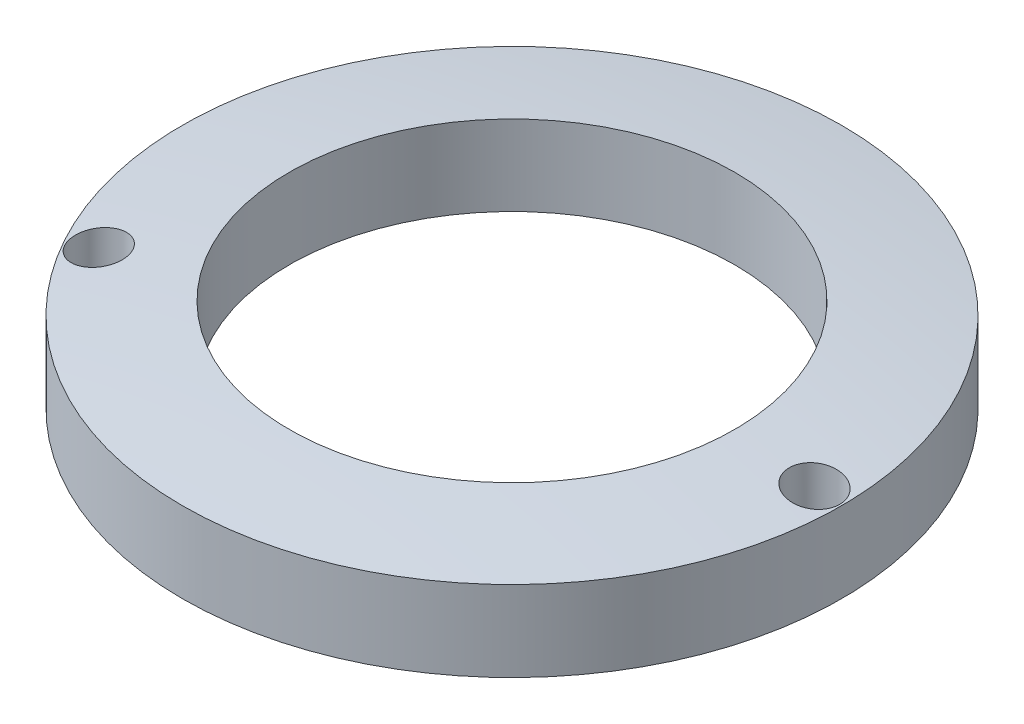
ISO-10303-21;
HEADER;
FILE_DESCRIPTION(('STEP AP214'),'2;1');
FILE_NAME('part.step','',(''),(''),'','','');
FILE_SCHEMA(('AUTOMOTIVE_DESIGN { 1 0 10303 214 1 1 1 1 }'));
ENDSEC;
DATA;
#1=APPLICATION_CONTEXT('core data for automotive mechanical design processes');
#2=APPLICATION_PROTOCOL_DEFINITION('international standard','automotive_design',2000,#1);
#3=PRODUCT_CONTEXT('',#1,'mechanical');
#4=PRODUCT('Part','Part','',(#3));
#5=PRODUCT_RELATED_PRODUCT_CATEGORY('part','',(#4));
#6=PRODUCT_DEFINITION_FORMATION('','',#4);
#7=PRODUCT_DEFINITION_CONTEXT('part definition',#1,'design');
#8=PRODUCT_DEFINITION('design','',#6,#7);
#9=PRODUCT_DEFINITION_SHAPE('','',#8);
#10=(LENGTH_UNIT() NAMED_UNIT(*) SI_UNIT(.MILLI.,.METRE.));
#11=(NAMED_UNIT(*) PLANE_ANGLE_UNIT() SI_UNIT($,.RADIAN.));
#12=(NAMED_UNIT(*) SI_UNIT($,.STERADIAN.) SOLID_ANGLE_UNIT());
#13=UNCERTAINTY_MEASURE_WITH_UNIT(LENGTH_MEASURE(1.E-05),#10,'distance_accuracy_value','');
#14=(GEOMETRIC_REPRESENTATION_CONTEXT(3) GLOBAL_UNCERTAINTY_ASSIGNED_CONTEXT((#13)) GLOBAL_UNIT_ASSIGNED_CONTEXT((#10,
#11,#12)) REPRESENTATION_CONTEXT('',''));
#15=CARTESIAN_POINT('',(0.,0.,0.));
#16=DIRECTION('',(0.,0.,1.));
#17=DIRECTION('',(1.,0.,0.));
#18=AXIS2_PLACEMENT_3D('',#15,#16,#17);
#19=CARTESIAN_POINT('',(0.,0.,0.));
#20=DIRECTION('',(0.,-1.,0.));
#21=DIRECTION('',(1.,0.,0.));
#22=AXIS2_PLACEMENT_3D('',#19,#20,#21);
#23=SPHERICAL_SURFACE('',#22,270.25);
#24=CARTESIAN_POINT('',(33.8748210520034,268.110191946633,-2.11745563731514));
#25=CARTESIAN_POINT('',(33.7566342169158,268.126061113324,-1.99882785031653));
#26=CARTESIAN_POINT('',(33.6482325747992,268.140615732032,-1.87011115871031));
#27=CARTESIAN_POINT('',(33.4542554238601,268.166657879572,-1.59606487354717));
#28=CARTESIAN_POINT('',(33.3687051319892,268.178142020079,-1.45071717780177));
#29=CARTESIAN_POINT('',(33.2230708792682,268.19769100597,-1.14757327787246));
#30=CARTESIAN_POINT('',(33.1629829895249,268.205756378876,-0.98977899867834));
#31=CARTESIAN_POINT('',(33.0700821017238,268.218225772245,-0.666258971449716));
#32=CARTESIAN_POINT('',(33.037262429422,268.222630688651,-0.500535174774585));
#33=CARTESIAN_POINT('',(32.9999509043105,268.227638469603,-0.166679806506815));
#34=CARTESIAN_POINT('',(32.9953236963594,268.228259500999,0.00143636981917927));
#35=CARTESIAN_POINT('',(33.0141757902299,268.225729275299,0.336059702495806));
#36=CARTESIAN_POINT('',(33.0376555592694,268.222577955495,0.502566832053126));
#37=CARTESIAN_POINT('',(33.1119370524958,268.212607937365,0.828873560222206));
#38=CARTESIAN_POINT('',(33.1626797104888,268.205797167391,0.988686857409833));
#39=CARTESIAN_POINT('',(33.2899444679582,268.188714473383,1.29749368980713));
#40=CARTESIAN_POINT('',(33.3664668042341,268.178442517558,1.44648712561558));
#41=CARTESIAN_POINT('',(33.5433678902146,268.154694444906,1.73002314791829));
#42=CARTESIAN_POINT('',(33.6438309299845,268.141207006985,1.86451218078449));
#43=CARTESIAN_POINT('',(33.8655509977646,268.111437744019,2.11472761211457));
#44=CARTESIAN_POINT('',(33.9868087594051,268.095155820385,2.23045334833575));
#45=CARTESIAN_POINT('',(34.2476655467542,268.060125511359,2.44082248276524));
#46=CARTESIAN_POINT('',(34.387398837805,268.041359069037,2.53529637050503));
#47=CARTESIAN_POINT('',(34.6804956364039,268.001991039657,2.69946792084331));
#48=CARTESIAN_POINT('',(34.8338597958272,267.981389364832,2.76916439770263));
#49=CARTESIAN_POINT('',(35.1512696834828,267.938745874557,2.88241049827879));
#50=CARTESIAN_POINT('',(35.3153953858558,267.916693271103,2.925731952833));
#51=CARTESIAN_POINT('',(35.648510674052,267.871928787457,2.98413347266546));
#52=CARTESIAN_POINT('',(35.8175004397025,267.849216882891,2.99921249243884));
#53=CARTESIAN_POINT('',(36.1565682888054,267.803640948663,3.00073154643874));
#54=CARTESIAN_POINT('',(36.3266471087594,267.780776786796,2.98700866327034));
#55=CARTESIAN_POINT('',(36.6621132085578,267.735673487465,2.93095999454714));
#56=CARTESIAN_POINT('',(36.8275004355219,267.713434357047,2.88863388673054));
#57=CARTESIAN_POINT('',(37.148918762869,267.670209057124,2.77650222412124));
#58=CARTESIAN_POINT('',(37.3049469486164,267.649223277953,2.70668815957792));
#59=CARTESIAN_POINT('',(37.6030880495625,267.609118983338,2.54148604193802));
#60=CARTESIAN_POINT('',(37.7452012645592,267.590000427663,2.44609853998684));
#61=CARTESIAN_POINT('',(38.0106522156855,267.554285815633,2.23295750074317));
#62=CARTESIAN_POINT('',(38.1340845209908,267.537677054542,2.11532389921269));
#63=CARTESIAN_POINT('',(38.3594184611513,267.507354293866,1.86065786002901));
#64=CARTESIAN_POINT('',(38.4613210715009,267.493640163128,1.72362630175272));
#65=CARTESIAN_POINT('',(38.6397753987595,267.469622228116,1.43530023637066));
#66=CARTESIAN_POINT('',(38.7165353833011,267.459290407071,1.28413696849114));
#67=CARTESIAN_POINT('',(38.8435817932535,267.442189425082,0.970878992282544));
#68=CARTESIAN_POINT('',(38.893869500614,267.435420091622,0.80878481372393));
#69=CARTESIAN_POINT('',(38.9661578950883,267.425689033931,0.479656380144535));
#70=CARTESIAN_POINT('',(38.988380951073,267.422697377482,0.312671825559643));
#71=CARTESIAN_POINT('',(39.0046072788964,267.420513007519,-0.0226854887005422));
#72=CARTESIAN_POINT('',(38.9986113671663,267.421320184097,-0.191058208072758));
#73=CARTESIAN_POINT('',(38.958660710383,267.426698248088,-0.52372134538931));
#74=CARTESIAN_POINT('',(38.9248150114554,267.431254456129,-0.688025115001661));
#75=CARTESIAN_POINT('',(38.8303150443874,267.443975174114,-1.00858268892265));
#76=CARTESIAN_POINT('',(38.7696607618451,267.452139685995,-1.16483648890666));
#77=CARTESIAN_POINT('',(38.6231972015243,267.471853469363,-1.46519831797986));
#78=CARTESIAN_POINT('',(38.5373412451101,267.483409021737,-1.60928316421017));
#79=CARTESIAN_POINT('',(38.3430258445032,267.50956022098,-1.88099147695932));
#80=CARTESIAN_POINT('',(38.234565672158,267.524155965783,-2.00861441297416));
#81=CARTESIAN_POINT('',(37.9973559713826,267.556074731758,-2.24471845272349));
#82=CARTESIAN_POINT('',(37.8684741182715,267.573415539129,-2.35306418701929));
#83=CARTESIAN_POINT('',(37.5946435122869,267.610254859392,-2.54661093254369));
#84=CARTESIAN_POINT('',(37.4496939879875,267.629753475883,-2.63181083183812));
#85=CARTESIAN_POINT('',(37.1464844145498,267.670536370907,-2.77742754512343));
#86=CARTESIAN_POINT('',(36.9881190929644,267.691834768124,-2.83762122038843));
#87=CARTESIAN_POINT('',(36.6636655628318,267.735464694298,-2.93053337626499));
#88=CARTESIAN_POINT('',(36.4975773242902,267.757796227268,-2.96325175015792));
#89=CARTESIAN_POINT('',(36.1611770150129,267.803021397737,-3.00047561058272));
#90=CARTESIAN_POINT('',(35.9908438976689,267.825917825525,-3.00478767138788));
#91=CARTESIAN_POINT('',(35.6518190650947,267.871484196704,-2.98456206308923));
#92=CARTESIAN_POINT('',(35.4831277976132,267.894154078357,-2.96001673491787));
#93=CARTESIAN_POINT('',(35.1518007953607,267.938674593639,-2.88263508608959));
#94=CARTESIAN_POINT('',(34.9891816155954,267.960522988546,-2.82972671588607));
#95=CARTESIAN_POINT('',(34.6752476191331,268.002696076445,-2.69703628961669));
#96=CARTESIAN_POINT('',(34.5239194411801,268.023022570487,-2.61728663285815));
#97=CARTESIAN_POINT('',(34.2891915878442,268.054548336168,-2.46676224764369));
#98=CARTESIAN_POINT('',(34.2011124361431,268.066377258445,-2.40328264668014));
#99=CARTESIAN_POINT('',(34.0322569365905,268.089052454216,-2.26710210382388));
#100=CARTESIAN_POINT('',(33.9514805769168,268.099898729301,-2.19440117685941));
#101=CARTESIAN_POINT('',(33.8748210520034,268.110191946633,-2.11745563731514));
#102=B_SPLINE_CURVE_WITH_KNOTS('',3,(#24,#25,#26,#27,#28,#29,#30,#31,#32,#33,#34,#35,#36,#37,
#38,#39,#40,#41,#42,#43,#44,#45,#46,#47,#48,#49,#50,#51,#52,#53,#54,#55,#56,#57,#58,#59,#60,#61,
#62,#63,#64,#65,#66,#67,#68,#69,#70,#71,#72,#73,#74,#75,#76,#77,#78,#79,#80,#81,#82,#83,#84,#85,
#86,#87,#88,#89,#90,#91,#92,#93,#94,#95,#96,#97,#98,#99,#100,#101),.UNSPECIFIED.,.T.,.F.,(4,2,2,
2,2,2,2,2,2,2,2,2,2,2,2,2,2,2,2,2,2,2,2,2,2,2,2,2,2,2,2,2,2,2,2,2,2,2,4),(0.,0.504217313290887,
1.00898876367502,1.51368229855581,2.01825226683611,2.52039781766302,3.02255171569263,
3.52362203756852,4.02469696215641,4.527562829559,5.03044644153995,5.53720918689176,
6.04399618044193,6.55510727815307,7.06623729627893,7.58026630110192,8.09430109739329,
8.60849515440136,9.12267813065783,9.63416417772537,10.145627044771,10.6527392831857,
11.1598269618647,11.6628710182489,12.1659005206526,12.6669697261641,13.1680392008588,
13.6700426784524,14.1720623296465,14.6774789677222,15.1829198819016,15.6927788564975,
16.2026398114609,16.7159689808202,17.2294344241342,17.7442104279674,18.2583672764971,
18.5854182736365,18.9124687413248),.UNSPECIFIED.);
#103=CARTESIAN_POINT('',(33.8748210520034,268.110191946633,-2.11745563731514));
#104=VERTEX_POINT('',#103);
#105=EDGE_CURVE('E59',#104,#104,#102,.T.);
#106=ORIENTED_EDGE('',*,*,#105,.T.);
#107=EDGE_LOOP('',(#106));
#108=FACE_BOUND('',#107,.T.);
#109=CARTESIAN_POINT('',(0.,267.38895657824,0.));
#110=DIRECTION('',(0.,-1.,0.));
#111=DIRECTION('',(0.,0.,-1.));
#112=AXIS2_PLACEMENT_3D('',#109,#110,#111);
#113=CIRCLE('',#112,39.22);
#114=CARTESIAN_POINT('',(0.,267.38895657824,-39.22));
#115=VERTEX_POINT('',#114);
#116=EDGE_CURVE('E10',#115,#115,#113,.T.);
#117=ORIENTED_EDGE('',*,*,#116,.T.);
#118=EDGE_LOOP('',(#117));
#119=FACE_BOUND('',#118,.T.);
#120=CARTESIAN_POINT('',(0.,268.946616264269,0.));
#121=DIRECTION('',(0.,-1.,0.));
#122=DIRECTION('',(0.,0.,-1.));
#123=AXIS2_PLACEMENT_3D('',#120,#121,#122);
#124=CIRCLE('',#123,26.51);
#125=CARTESIAN_POINT('',(0.,268.946616264269,-26.51));
#126=VERTEX_POINT('',#125);
#127=EDGE_CURVE('E83',#126,#126,#124,.T.);
#128=ORIENTED_EDGE('',*,*,#127,.F.);
#129=EDGE_LOOP('',(#128));
#130=FACE_BOUND('',#129,.T.);
#131=CARTESIAN_POINT('',(-33.2575393534441,267.727720951441,15.8387502758738));
#132=CARTESIAN_POINT('',(-33.3793015351468,267.705660077118,15.9559801413458));
#133=CARTESIAN_POINT('',(-33.4912636586201,267.684035988823,16.0836466974702));
#134=CARTESIAN_POINT('',(-33.6922596330757,267.642289474537,16.3562895597185));
#135=CARTESIAN_POINT('',(-33.7812668179456,267.622168814129,16.5012857136809));
#136=CARTESIAN_POINT('',(-33.9336131258105,267.584028750472,16.8044363569805));
#137=CARTESIAN_POINT('',(-33.9969562989633,267.566009015987,16.9625887653157));
#138=CARTESIAN_POINT('',(-34.0960322862219,267.532602046169,17.2875403570274));
#139=CARTESIAN_POINT('',(-34.1317723560798,267.517214119869,17.4543372558032));
#140=CARTESIAN_POINT('',(-34.1743886325436,267.489603882682,17.7908477028342));
#141=CARTESIAN_POINT('',(-34.1814312563982,267.477363706917,17.9605386878008));
#142=CARTESIAN_POINT('',(-34.1667862809966,267.456299914433,18.2988971072288));
#143=CARTESIAN_POINT('',(-34.1450989367728,267.447476267386,18.4675645507627));
#144=CARTESIAN_POINT('',(-34.0738377524782,267.43357398587,18.7975499536216));
#145=CARTESIAN_POINT('',(-34.0245035432514,267.428464025431,18.9589183602977));
#146=CARTESIAN_POINT('',(-33.8994833926352,267.422021187206,19.271180600943));
#147=CARTESIAN_POINT('',(-33.8237984811024,267.420688161825,19.4220748439943));
#148=CARTESIAN_POINT('',(-33.6487078045413,267.421836269065,19.7082836607177));
#149=CARTESIAN_POINT('',(-33.5494302092204,267.424297174014,19.8436767522319));
#150=CARTESIAN_POINT('',(-33.3297881909491,267.432921539283,20.0959744293874));
#151=CARTESIAN_POINT('',(-33.2094239594727,267.439084965984,20.2128791828908));
#152=CARTESIAN_POINT('',(-32.9510356218144,267.454932116281,20.4249612812851));
#153=CARTESIAN_POINT('',(-32.8130075923072,267.464616622829,20.5201337860869));
#154=CARTESIAN_POINT('',(-32.5232543044256,267.48721990451,20.6861215331342));
#155=CARTESIAN_POINT('',(-32.371528713548,267.500138758169,20.7569361839012));
#156=CARTESIAN_POINT('',(-32.0577892127872,267.528916303892,20.8726594400928));
#157=CARTESIAN_POINT('',(-31.8957223020539,267.54479110091,20.9174203019582));
#158=CARTESIAN_POINT('',(-31.5666444154433,267.578974039687,20.9792859218482));
#159=CARTESIAN_POINT('',(-31.3996332268425,267.597282286262,20.9963894881742));
#160=CARTESIAN_POINT('',(-31.0638837248674,267.635978324455,21.0026079770012));
#161=CARTESIAN_POINT('',(-30.8951428512852,267.65638255432,20.9914824020852));
#162=CARTESIAN_POINT('',(-30.5620788611804,267.698559951365,20.9411473050748));
#163=CARTESIAN_POINT('',(-30.3977559464196,267.720333180914,20.9019365026202));
#164=CARTESIAN_POINT('',(-30.0768427591206,267.76481158248,20.7961767741625));
#165=CARTESIAN_POINT('',(-29.9203226149474,267.787522688389,20.7294174732467));
#166=CARTESIAN_POINT('',(-29.6208009520962,267.833075151389,20.5704587271744));
#167=CARTESIAN_POINT('',(-29.4777998126528,267.855916512114,20.478258568636));
#168=CARTESIAN_POINT('',(-29.2088633969345,267.90116841697,20.2706249742627));
#169=CARTESIAN_POINT('',(-29.0829920739584,267.923577092307,20.1551082671137));
#170=CARTESIAN_POINT('',(-28.8525525810634,267.967239023512,19.9042959756846));
#171=CARTESIAN_POINT('',(-28.7479843586631,267.988492282227,19.7690004401322));
#172=CARTESIAN_POINT('',(-28.563410452566,268.029188772111,19.4827462987591));
#173=CARTESIAN_POINT('',(-28.4833530277976,268.04863575489,19.3318215999367));
#174=CARTESIAN_POINT('',(-28.3499040959961,268.085205341504,19.018345491905));
#175=CARTESIAN_POINT('',(-28.2965116988114,268.102328022916,18.8557944710212));
#176=CARTESIAN_POINT('',(-28.2183346378223,268.133633825043,18.5248872502815));
#177=CARTESIAN_POINT('',(-28.1933529312094,268.147836625997,18.356579479151));
#178=CARTESIAN_POINT('',(-28.1721752365416,268.173030754254,18.0179232241929));
#179=CARTESIAN_POINT('',(-28.1759778429555,268.184022238338,17.8475748404135));
#180=CARTESIAN_POINT('',(-28.2122068786977,268.202382560642,17.5112624254168));
#181=CARTESIAN_POINT('',(-28.2443828908496,268.209782215733,17.3452730896939));
#182=CARTESIAN_POINT('',(-28.3361700972544,268.220879582788,17.0209327819494));
#183=CARTESIAN_POINT('',(-28.3957800972489,268.224577455878,16.8625814777599));
#184=CARTESIAN_POINT('',(-28.5402718326884,268.22814809765,16.5591066609753));
#185=CARTESIAN_POINT('',(-28.6249837289312,268.228046016025,16.4139025508301));
#186=CARTESIAN_POINT('',(-28.8174033575395,268.22408223368,16.1396880686549));
#187=CARTESIAN_POINT('',(-28.925110730429,268.220220591727,16.0106774435307));
#188=CARTESIAN_POINT('',(-29.1602336862458,268.208862032491,15.7726842258353));
#189=CARTESIAN_POINT('',(-29.2876174350468,268.201370946128,15.6636698939715));
#190=CARTESIAN_POINT('',(-29.5585703271931,268.182976838607,15.4684298976481));
#191=CARTESIAN_POINT('',(-29.702139737312,268.172073761207,15.3822046088784));
#192=CARTESIAN_POINT('',(-30.0019952394796,268.147121694368,15.2345694377396));
#193=CARTESIAN_POINT('',(-30.158330940996,268.133060020567,15.1732624925075));
#194=CARTESIAN_POINT('',(-30.4787723800924,268.102222708261,15.0775764648259));
#195=CARTESIAN_POINT('',(-30.6428781126331,268.085447071516,15.0431973649123));
#196=CARTESIAN_POINT('',(-30.9755806091296,268.049516748581,15.0020371342725));
#197=CARTESIAN_POINT('',(-31.1442025128085,268.030344423115,14.9954747328005));
#198=CARTESIAN_POINT('',(-31.4800088492696,267.990263758568,15.0106205783543));
#199=CARTESIAN_POINT('',(-31.6471928485079,267.969354914851,15.0323370703865));
#200=CARTESIAN_POINT('',(-31.9768883154717,267.926201726519,15.1036658252577));
#201=CARTESIAN_POINT('',(-32.1393450803052,267.903947167927,15.1535241895176));
#202=CARTESIAN_POINT('',(-32.453337933687,267.858916593764,15.2798311181724));
#203=CARTESIAN_POINT('',(-32.6048863235129,267.836141204987,15.3562491458836));
#204=CARTESIAN_POINT('',(-32.8403638293936,267.798993154585,15.5010983981033));
#205=CARTESIAN_POINT('',(-32.928817198008,267.784581387552,15.5623010222634));
#206=CARTESIAN_POINT('',(-33.0986817394854,267.755961162128,15.6938450884504));
#207=CARTESIAN_POINT('',(-33.180092881667,267.741752704624,15.7641865702901));
#208=CARTESIAN_POINT('',(-33.2575393534441,267.727720951441,15.8387502758738));
#209=B_SPLINE_CURVE_WITH_KNOTS('',3,(#131,#132,#133,#134,#135,#136,#137,#138,#139,#140,#141,
#142,#143,#144,#145,#146,#147,#148,#149,#150,#151,#152,#153,#154,#155,#156,#157,#158,#159,#160,
#161,#162,#163,#164,#165,#166,#167,#168,#169,#170,#171,#172,#173,#174,#175,#176,#177,#178,#179,
#180,#181,#182,#183,#184,#185,#186,#187,#188,#189,#190,#191,#192,#193,#194,#195,#196,#197,#198,
#199,#200,#201,#202,#203,#204,#205,#206,#207,#208),.UNSPECIFIED.,.T.,.F.,(4,2,2,2,2,2,2,2,2,2,2,
2,2,2,2,2,2,2,2,2,2,2,2,2,2,2,2,2,2,2,2,2,2,2,2,2,2,2,4),(0.,0.510978394161927,1.02254773079922,
1.53403630280631,2.04539037911902,2.55377484266272,3.06215479336758,3.5661950058381,
4.07021552126609,4.57155808565204,5.07289609791017,5.57434565679508,6.07580739145262,
6.58008574373898,7.08438582381019,7.5929966745351,8.10163071348055,8.61422302287604,
9.12682970722696,9.64130054867562,10.1557701226808,10.6691460676999,11.18250487368,
11.6922811329678,12.2020325001619,12.7073294489611,13.2126044032149,13.7145358343714,
14.2164594196723,14.7175792949976,15.218707431042,15.7218851760472,16.2250625947151,
16.7321893600894,17.2394640166732,17.7512451054231,18.2624397153802,18.5874445799879,
18.9124508604997),.UNSPECIFIED.);
#210=CARTESIAN_POINT('',(-33.2575393534441,267.727720951441,15.8387502758738));
#211=VERTEX_POINT('',#210);
#212=EDGE_CURVE('E77',#211,#211,#209,.T.);
#213=ORIENTED_EDGE('',*,*,#212,.T.);
#214=EDGE_LOOP('',(#213));
#215=FACE_BOUND('',#214,.T.);
#216=ADVANCED_FACE('F32',(#108,#119,#130,#215),#23,.F.);
#217=CARTESIAN_POINT('',(0.,1.,0.));
#218=DIRECTION('',(0.,-1.,0.));
#219=DIRECTION('',(1.,0.,0.));
#220=AXIS2_PLACEMENT_3D('',#217,#218,#219);
#221=SPHERICAL_SURFACE('',#220,278.75);
#222=CARTESIAN_POINT('',(33.8750497299697,277.6759088615,-2.11768513805115));
#223=CARTESIAN_POINT('',(33.9947080617952,277.660339193048,-2.23774322460813));
#224=CARTESIAN_POINT('',(34.1245725004374,277.643441047989,-2.34764199570258));
#225=CARTESIAN_POINT('',(34.4008926415647,277.607481246938,-2.5439433971789));
#226=CARTESIAN_POINT('',(34.5473697994282,277.58841679309,-2.63031514143792));
#227=CARTESIAN_POINT('',(34.8524993383582,277.54869897859,-2.77702427245992));
#228=CARTESIAN_POINT('',(35.0111421158502,277.528046871206,-2.837381950606));
#229=CARTESIAN_POINT('',(35.3361469530402,277.485732680513,-2.93050731470765));
#230=CARTESIAN_POINT('',(35.5025070415425,277.464070855107,-2.96328200555696));
#231=CARTESIAN_POINT('',(35.8391287595213,277.420233900086,-3.00048838067479));
#232=CARTESIAN_POINT('',(36.0094053265693,277.398056799987,-3.00478272653073));
#233=CARTESIAN_POINT('',(36.3482751122275,277.353916526996,-2.98454651003211));
#234=CARTESIAN_POINT('',(36.5168682260602,277.331953367421,-2.96001416465479));
#235=CARTESIAN_POINT('',(36.8479172924988,277.28882156357,-2.88270443174746));
#236=CARTESIAN_POINT('',(37.0103604398936,277.267654577591,-2.82987124549255));
#237=CARTESIAN_POINT('',(37.3241009401706,277.226768526666,-2.69736043637334));
#238=CARTESIAN_POINT('',(37.4753984372887,277.207049442983,-2.61768316097261));
#239=CARTESIAN_POINT('',(37.76196931601,277.16969612432,-2.43399481489471));
#240=CARTESIAN_POINT('',(37.8972958664021,277.152054972113,-2.33006812340821));
#241=CARTESIAN_POINT('',(38.1485641921208,277.119296947955,-2.10062215995656));
#242=CARTESIAN_POINT('',(38.2645067285655,277.104179976891,-1.97510373618895));
#243=CARTESIAN_POINT('',(38.4727896108854,277.077021556736,-1.70701860775395));
#244=CARTESIAN_POINT('',(38.5652977834516,277.064958239199,-1.56458451878833));
#245=CARTESIAN_POINT('',(38.7250640825748,277.044123275806,-1.26597573084944));
#246=CARTESIAN_POINT('',(38.792323362372,277.03535147961,-1.10980165985051));
#247=CARTESIAN_POINT('',(38.8991316055451,277.021421402145,-0.789498785242182));
#248=CARTESIAN_POINT('',(38.9388992466188,277.016234604659,-0.625444125205862));
#249=CARTESIAN_POINT('',(38.9904014221785,277.009517243698,-0.292920496923406));
#250=CARTESIAN_POINT('',(39.0021369470989,277.007986551046,-0.124451684851334));
#251=CARTESIAN_POINT('',(38.9972360247906,277.008625782359,0.2111965607268));
#252=CARTESIAN_POINT('',(38.9807449099646,277.010776750311,0.378378173720266));
#253=CARTESIAN_POINT('',(38.9201626831219,277.018678357515,0.707572827872306));
#254=CARTESIAN_POINT('',(38.8760717892213,277.024428968319,0.869585909866207));
#255=CARTESIAN_POINT('',(38.76159678061,277.039358764533,1.1838729031632));
#256=CARTESIAN_POINT('',(38.6912118749355,277.048538053082,1.33614652132696));
#257=CARTESIAN_POINT('',(38.5262155320009,277.070054690764,1.62669860682799));
#258=CARTESIAN_POINT('',(38.4316035852879,277.082392106305,1.76497677977978));
#259=CARTESIAN_POINT('',(38.2203475680141,277.109937642962,2.02439667754946));
#260=CARTESIAN_POINT('',(38.1035927400711,277.125160195101,2.14544665730501));
#261=CARTESIAN_POINT('',(37.8517292087462,277.157995115117,2.36625238867216));
#262=CARTESIAN_POINT('',(37.7166197604942,277.175607579981,2.46600727566029));
#263=CARTESIAN_POINT('',(37.4307284883409,277.212871528863,2.64224103145432));
#264=CARTESIAN_POINT('',(37.2798300114672,277.232538187558,2.7185274532751));
#265=CARTESIAN_POINT('',(36.9675397106407,277.273234415818,2.84468468832365));
#266=CARTESIAN_POINT('',(36.8061474371529,277.29426404377,2.89455436906866));
#267=CARTESIAN_POINT('',(36.4761709281416,277.337255284813,2.96681587432914));
#268=CARTESIAN_POINT('',(36.3075423711252,277.359222635104,2.98900199109869));
#269=CARTESIAN_POINT('',(35.9689781212351,277.40332226925,3.00462265659204));
#270=CARTESIAN_POINT('',(35.7990423924891,277.425454557631,2.99805641344463));
#271=CARTESIAN_POINT('',(35.4620494752131,277.469339025251,2.95627101531336));
#272=CARTESIAN_POINT('',(35.2950047372273,277.491089564329,2.92094959480843));
#273=CARTESIAN_POINT('',(34.969181944944,277.533509452574,2.8224772677582));
#274=CARTESIAN_POINT('',(34.8104038701367,277.554178804423,2.75932643026241));
#275=CARTESIAN_POINT('',(34.5059598395363,277.593806481437,2.60705935159693));
#276=CARTESIAN_POINT('',(34.3602704328152,277.612767866928,2.51799081243328));
#277=CARTESIAN_POINT('',(34.0859123844661,277.648472122246,2.31630163134464));
#278=CARTESIAN_POINT('',(33.9572432564269,277.665215055473,2.20368166271786));
#279=CARTESIAN_POINT('',(33.7214865246239,277.695890292138,1.95884460070274));
#280=CARTESIAN_POINT('',(33.6142650742665,277.709840027423,1.82675859268829));
#281=CARTESIAN_POINT('',(33.4235508642033,277.734650870177,1.54618216276873));
#282=CARTESIAN_POINT('',(33.3400570617778,277.74551211337,1.3976924621279));
#283=CARTESIAN_POINT('',(33.1998855836128,277.763745495807,1.08983152598729));
#284=CARTESIAN_POINT('',(33.142993780999,277.771145495714,0.930559424380407));
#285=CARTESIAN_POINT('',(33.0567273639715,277.782366059581,0.604616527930171));
#286=CARTESIAN_POINT('',(33.0273505369383,277.786186911358,0.437946329134657));
#287=CARTESIAN_POINT('',(32.9970918338032,277.790122461261,0.10308246404889));
#288=CARTESIAN_POINT('',(32.996027754112,277.790260857427,-0.0650944898608359));
#289=CARTESIAN_POINT('',(33.021969276818,277.786886817179,-0.399276565450932));
#290=CARTESIAN_POINT('',(33.0489814678223,277.78337352383,-0.565281168090759));
#291=CARTESIAN_POINT('',(33.1302161406483,277.7728074952,-0.890143005655299));
#292=CARTESIAN_POINT('',(33.1844060279078,277.765758999733,-1.04900855444891));
#293=CARTESIAN_POINT('',(33.3183476729617,277.748336093956,-1.35521340651783));
#294=CARTESIAN_POINT('',(33.3980686262033,277.737965691694,-1.50256633519698));
#295=CARTESIAN_POINT('',(33.5453408722376,277.718806801646,-1.72775906487092));
#296=CARTESIAN_POINT('',(33.6057066385879,277.710953482444,-1.81047153374509));
#297=CARTESIAN_POINT('',(33.7344952827684,277.694197309782,-1.96924827945069));
#298=CARTESIAN_POINT('',(33.8029181413775,277.685294458826,-2.04531257214138));
#299=CARTESIAN_POINT('',(33.8750497299697,277.6759088615,-2.11768513805115));
#300=B_SPLINE_CURVE_WITH_KNOTS('',3,(#222,#223,#224,#225,#226,#227,#228,#229,#230,#231,#232,
#233,#234,#235,#236,#237,#238,#239,#240,#241,#242,#243,#244,#245,#246,#247,#248,#249,#250,#251,
#252,#253,#254,#255,#256,#257,#258,#259,#260,#261,#262,#263,#264,#265,#266,#267,#268,#269,#270,
#271,#272,#273,#274,#275,#276,#277,#278,#279,#280,#281,#282,#283,#284,#285,#286,#287,#288,#289,
#290,#291,#292,#293,#294,#295,#296,#297,#298,#299),.UNSPECIFIED.,.T.,.F.,(4,2,2,2,2,2,2,2,2,2,2,
2,2,2,2,2,2,2,2,2,2,2,2,2,2,2,2,2,2,2,2,2,2,2,2,2,2,2,4),(0.,0.510278719490991,1.02122413581139,
1.53177028215034,2.04218673254393,2.55506274347673,3.067970479096,3.5818932202379,
4.09580930954012,4.60796314425968,5.12009686440731,5.62845203746038,6.13678398862498,
6.64102447427593,7.14524714376842,7.6468814906317,8.14851187322002,8.65015734683051,
9.15181337004911,9.65604818811224,10.1603034752278,10.6685898552588,11.1768980237073,
11.68896120052,12.2010384801973,12.7149449196066,13.2288500839337,13.7418153151668,
14.2547658835373,14.7644079537134,15.2740276240292,15.7794714418759,16.2848746109195,
16.7870245210117,17.2892922963173,17.7909591307271,18.2920229442119,18.5996262837084,
18.9072288893954),.UNSPECIFIED.);
#301=CARTESIAN_POINT('',(33.8750497299697,277.6759088615,-2.11768513805115));
#302=VERTEX_POINT('',#301);
#303=EDGE_CURVE('E53',#302,#302,#300,.T.);
#304=ORIENTED_EDGE('',*,*,#303,.T.);
#305=EDGE_LOOP('',(#304));
#306=FACE_BOUND('',#305,.T.);
#307=CARTESIAN_POINT('',(0.,278.48654453865,0.));
#308=DIRECTION('',(0.,-1.,0.));
#309=DIRECTION('',(0.,0.,-1.));
#310=AXIS2_PLACEMENT_3D('',#307,#308,#309);
#311=CIRCLE('',#310,26.51);
#312=CARTESIAN_POINT('',(0.,278.48654453865,-26.51));
#313=VERTEX_POINT('',#312);
#314=EDGE_CURVE('E50',#313,#313,#311,.T.);
#315=ORIENTED_EDGE('',*,*,#314,.T.);
#316=EDGE_LOOP('',(#315));
#317=FACE_BOUND('',#316,.T.);
#318=CARTESIAN_POINT('',(0.,276.977089810006,0.));
#319=DIRECTION('',(0.,-1.,0.));
#320=DIRECTION('',(0.,0.,-1.));
#321=AXIS2_PLACEMENT_3D('',#318,#319,#320);
#322=CIRCLE('',#321,39.22);
#323=CARTESIAN_POINT('',(0.,276.977089810006,-39.22));
#324=VERTEX_POINT('',#323);
#325=EDGE_CURVE('E45',#324,#324,#322,.T.);
#326=ORIENTED_EDGE('',*,*,#325,.F.);
#327=EDGE_LOOP('',(#326));
#328=FACE_BOUND('',#327,.T.);
#329=CARTESIAN_POINT('',(-33.2600008326467,277.304892606535,15.8411226339312));
#330=CARTESIAN_POINT('',(-33.1377192195627,277.326376017024,15.7231443518751));
#331=CARTESIAN_POINT('',(-33.0053415983504,277.348320969375,15.6155293210079));
#332=CARTESIAN_POINT('',(-32.7242025942941,277.392498824099,15.4241735555624));
#333=CARTESIAN_POINT('',(-32.5754209119929,277.414732052506,15.3404628720028));
#334=CARTESIAN_POINT('',(-32.2658466135394,277.45882880793,15.1994409785708));
#335=CARTESIAN_POINT('',(-32.1050595620329,277.480692500539,15.1421176250286));
#336=CARTESIAN_POINT('',(-31.7760239178659,277.523430718145,15.0555126888069));
#337=CARTESIAN_POINT('',(-31.6077773140251,277.544305503765,15.0262236782664));
#338=CARTESIAN_POINT('',(-31.2687484453384,277.584452858589,14.99658733255));
#339=CARTESIAN_POINT('',(-31.097969153982,277.603727154622,14.9962083890036));
#340=CARTESIAN_POINT('',(-30.7585814380266,277.6401414628,15.0244342782369));
#341=CARTESIAN_POINT('',(-30.5899730461273,277.657281442831,15.0530395470824));
#342=CARTESIAN_POINT('',(-30.2608435243897,277.688824818111,15.1382639965174));
#343=CARTESIAN_POINT('',(-30.1002788497618,277.703244472969,15.1947089346733));
#344=CARTESIAN_POINT('',(-29.7907883823011,277.729051981626,15.3340202698216));
#345=CARTESIAN_POINT('',(-29.6418620294059,277.740439981378,15.4168853944385));
#346=CARTESIAN_POINT('',(-29.361174425397,277.759763740327,15.6059476654268));
#347=CARTESIAN_POINT('',(-29.2292823784946,277.767727054535,15.7119478238473));
#348=CARTESIAN_POINT('',(-28.9850827477287,277.780098602727,15.9446850217527));
#349=CARTESIAN_POINT('',(-28.8727743139764,277.784506991016,16.0714211608755));
#350=CARTESIAN_POINT('',(-28.6716822038068,277.789619379413,16.3411094177174));
#351=CARTESIAN_POINT('',(-28.5827480159702,277.790347659641,16.4839488755796));
#352=CARTESIAN_POINT('',(-28.429977341349,277.788143876372,16.7824434159252));
#353=CARTESIAN_POINT('',(-28.3661403933077,277.78521188015,16.9380982628138));
#354=CARTESIAN_POINT('',(-28.2654593335124,277.77578498576,17.2574374300653));
#355=CARTESIAN_POINT('',(-28.2285585794343,277.769297614575,17.4211041244638));
#356=CARTESIAN_POINT('',(-28.18250551494,277.752956282874,17.7521284263549));
#357=CARTESIAN_POINT('',(-28.1733534731647,277.743102289765,17.9194860695645));
#358=CARTESIAN_POINT('',(-28.1829764088793,277.720277286119,18.2537298638421));
#359=CARTESIAN_POINT('',(-28.2018428713376,277.707296181131,18.4206126799121));
#360=CARTESIAN_POINT('',(-28.2670267694719,277.678609148041,18.7486830430739));
#361=CARTESIAN_POINT('',(-28.31334515311,277.662903125857,18.9098703932877));
#362=CARTESIAN_POINT('',(-28.4324605362127,277.629091164202,19.2232201271451));
#363=CARTESIAN_POINT('',(-28.505445957236,277.610968744651,19.3753090974096));
#364=CARTESIAN_POINT('',(-28.6756994028287,277.572927107186,19.6649776015082));
#365=CARTESIAN_POINT('',(-28.7729684978118,277.553007810093,19.8025564953642));
#366=CARTESIAN_POINT('',(-28.9898812767892,277.511765028193,20.0604618683368));
#367=CARTESIAN_POINT('',(-29.1096984425809,277.490431547701,20.1806408590724));
#368=CARTESIAN_POINT('',(-29.3677745582187,277.447106719686,20.3990822336183));
#369=CARTESIAN_POINT('',(-29.5060341620384,277.425115348855,20.4973438399023));
#370=CARTESIAN_POINT('',(-29.7978937629746,277.380972292266,20.6696769462621));
#371=CARTESIAN_POINT('',(-29.9515724748732,277.358820381566,20.7436151216468));
#372=CARTESIAN_POINT('',(-30.2692958255717,277.315102755089,20.8644574835329));
#373=CARTESIAN_POINT('',(-30.4333405760846,277.293537045632,20.9113613786355));
#374=CARTESIAN_POINT('',(-30.7672157863119,277.251598910485,20.9767590396008));
#375=CARTESIAN_POINT('',(-30.9370484015424,277.231226937219,20.9952421001392));
#376=CARTESIAN_POINT('',(-31.2775963573715,277.192273286222,21.0031433265342));
#377=CARTESIAN_POINT('',(-31.4483116808422,277.173691573889,20.992562054256));
#378=CARTESIAN_POINT('',(-31.7848854629673,277.138947226929,20.9426475020767));
#379=CARTESIAN_POINT('',(-31.9507634791826,277.122773284677,20.9034540753674));
#380=CARTESIAN_POINT('',(-32.2737243557243,277.093214675334,20.7974788127535));
#381=CARTESIAN_POINT('',(-32.4308075968878,277.079829887396,20.7306981724993));
#382=CARTESIAN_POINT('',(-32.7303813662184,277.056344991436,20.5720117252954));
#383=CARTESIAN_POINT('',(-32.8729781721221,277.046219566954,20.4803103036543));
#384=CARTESIAN_POINT('',(-33.1408375490322,277.029412466952,20.2741084549139));
#385=CARTESIAN_POINT('',(-33.2661008777982,277.022730640856,20.1596090249986));
#386=CARTESIAN_POINT('',(-33.4947592549067,277.013049839712,19.9120096738195));
#387=CARTESIAN_POINT('',(-33.598311856683,277.010023513844,19.7790562940931));
#388=CARTESIAN_POINT('',(-33.7817437514414,277.007653322812,19.4976870300747));
#389=CARTESIAN_POINT('',(-33.8616236512877,277.00830936324,19.349271542295));
#390=CARTESIAN_POINT('',(-33.9951820232279,277.013274577092,19.041805390239));
#391=CARTESIAN_POINT('',(-34.048957027988,277.017570127674,18.8827964200293));
#392=CARTESIAN_POINT('',(-34.1292678842314,277.029667824903,18.5581800204699));
#393=CARTESIAN_POINT('',(-34.1558047970911,277.037469834899,18.3925728484913));
#394=CARTESIAN_POINT('',(-34.1809932346839,277.056364217124,18.0591820691262));
#395=CARTESIAN_POINT('',(-34.1796013480524,277.067461685299,17.8913954786913));
#396=CARTESIAN_POINT('',(-34.1489628301053,277.092621463035,17.5585677791432));
#397=CARTESIAN_POINT('',(-34.1197085013257,277.106684591074,17.3935274415484));
#398=CARTESIAN_POINT('',(-34.0339879853202,277.137470366526,17.0697424529142));
#399=CARTESIAN_POINT('',(-33.9773387625732,277.154210388331,16.911048036324));
#400=CARTESIAN_POINT('',(-33.8384826212613,277.189788690267,16.6056799104236));
#401=CARTESIAN_POINT('',(-33.7563051760964,277.208624534668,16.4589925839375));
#402=CARTESIAN_POINT('',(-33.6040595733814,277.240491013906,16.2336663484084));
#403=CARTESIAN_POINT('',(-33.5410025403948,277.25305049991,16.1501337178007));
#404=CARTESIAN_POINT('',(-33.40656982006,277.278646018151,15.9901353843008));
#405=CARTESIAN_POINT('',(-33.3351941039838,277.291682052035,15.9136697058155));
#406=CARTESIAN_POINT('',(-33.2600008326467,277.304892606535,15.8411226339312));
#407=B_SPLINE_CURVE_WITH_KNOTS('',3,(#329,#330,#331,#332,#333,#334,#335,#336,#337,#338,#339,
#340,#341,#342,#343,#344,#345,#346,#347,#348,#349,#350,#351,#352,#353,#354,#355,#356,#357,#358,
#359,#360,#361,#362,#363,#364,#365,#366,#367,#368,#369,#370,#371,#372,#373,#374,#375,#376,#377,
#378,#379,#380,#381,#382,#383,#384,#385,#386,#387,#388,#389,#390,#391,#392,#393,#394,#395,#396,
#397,#398,#399,#400,#401,#402,#403,#404,#405,#406),.UNSPECIFIED.,.T.,.F.,(4,2,2,2,2,2,2,2,2,2,2,
2,2,2,2,2,2,2,2,2,2,2,2,2,2,2,2,2,2,2,2,2,2,2,2,2,2,2,4),(0.,0.513423515947468,1.02748966190904,
1.5413189932371,2.05501214480266,2.56814364992162,3.08128287518969,3.59125046672483,
4.10119350233091,4.60695307357325,5.1126906904214,5.6150872226928,6.11747452109667,
6.61880231530319,7.12013496294719,7.62310814619621,8.12609869898639,8.63271422656016,
9.13935208946925,9.65006034421958,10.1607867136297,10.6742676237925,11.1877540685938,
11.7014338818714,12.2151037648723,12.726279553021,13.2374331887543,13.7445149644527,
14.2515745652851,14.7548163162563,15.2580451652014,15.7593986862063,16.2607326704169,
16.7628459676073,17.2650980222138,17.7707531711031,18.2758266761936,18.591539394119,
18.9072532023672),.UNSPECIFIED.);
#408=CARTESIAN_POINT('',(-33.2600008326467,277.304892606535,15.8411226339312));
#409=VERTEX_POINT('',#408);
#410=EDGE_CURVE('E36',#409,#409,#407,.T.);
#411=ORIENTED_EDGE('',*,*,#410,.T.);
#412=EDGE_LOOP('',(#411));
#413=FACE_BOUND('',#412,.T.);
#414=ADVANCED_FACE('F60',(#306,#317,#328,#413),#221,.T.);
#415=CARTESIAN_POINT('',(0.,0.,0.));
#416=DIRECTION('',(0.,-1.,0.));
#417=DIRECTION('',(0.,0.,-1.));
#418=AXIS2_PLACEMENT_3D('',#415,#416,#417);
#419=CYLINDRICAL_SURFACE('',#418,39.22);
#420=ORIENTED_EDGE('',*,*,#325,.T.);
#421=EDGE_LOOP('',(#420));
#422=FACE_BOUND('',#421,.T.);
#423=ORIENTED_EDGE('',*,*,#116,.F.);
#424=EDGE_LOOP('',(#423));
#425=FACE_BOUND('',#424,.T.);
#426=ADVANCED_FACE('F91',(#422,#425),#419,.T.);
#427=CARTESIAN_POINT('',(0.,0.,0.));
#428=DIRECTION('',(0.,-1.,0.));
#429=DIRECTION('',(0.,0.,-1.));
#430=AXIS2_PLACEMENT_3D('',#427,#428,#429);
#431=CYLINDRICAL_SURFACE('',#430,26.51);
#432=ORIENTED_EDGE('',*,*,#127,.T.);
#433=EDGE_LOOP('',(#432));
#434=FACE_BOUND('',#433,.T.);
#435=ORIENTED_EDGE('',*,*,#314,.F.);
#436=EDGE_LOOP('',(#435));
#437=FACE_BOUND('',#436,.T.);
#438=ADVANCED_FACE('F67',(#434,#437),#431,.F.);
#439=CARTESIAN_POINT('',(36.,278.48654453865,0.));
#440=DIRECTION('',(0.,-1.,0.));
#441=DIRECTION('',(0.,0.,-1.));
#442=AXIS2_PLACEMENT_3D('',#439,#440,#441);
#443=CYLINDRICAL_SURFACE('',#442,3.);
#444=ORIENTED_EDGE('',*,*,#105,.F.);
#445=EDGE_LOOP('',(#444));
#446=FACE_BOUND('',#445,.T.);
#447=ORIENTED_EDGE('',*,*,#303,.F.);
#448=EDGE_LOOP('',(#447));
#449=FACE_BOUND('',#448,.T.);
#450=ADVANCED_FACE('F63',(#446,#449),#443,.F.);
#451=CARTESIAN_POINT('',(-31.1769145362399,278.48654453865,17.9999999999998));
#452=DIRECTION('',(0.,-1.,0.));
#453=DIRECTION('',(0.,0.,-1.));
#454=AXIS2_PLACEMENT_3D('',#451,#452,#453);
#455=CYLINDRICAL_SURFACE('',#454,2.99999999999999);
#456=ORIENTED_EDGE('',*,*,#212,.F.);
#457=EDGE_LOOP('',(#456));
#458=FACE_BOUND('',#457,.T.);
#459=ORIENTED_EDGE('',*,*,#410,.F.);
#460=EDGE_LOOP('',(#459));
#461=FACE_BOUND('',#460,.T.);
#462=ADVANCED_FACE('F66',(#458,#461),#455,.F.);
#463=CLOSED_SHELL('',(#216,#414,#426,#438,#450,#462));
#464=MANIFOLD_SOLID_BREP('B2',#463);
#465=ADVANCED_BREP_SHAPE_REPRESENTATION('',(#18,#464),#14);
#466=SHAPE_DEFINITION_REPRESENTATION(#9,#465);
ENDSEC;
END-ISO-10303-21;
